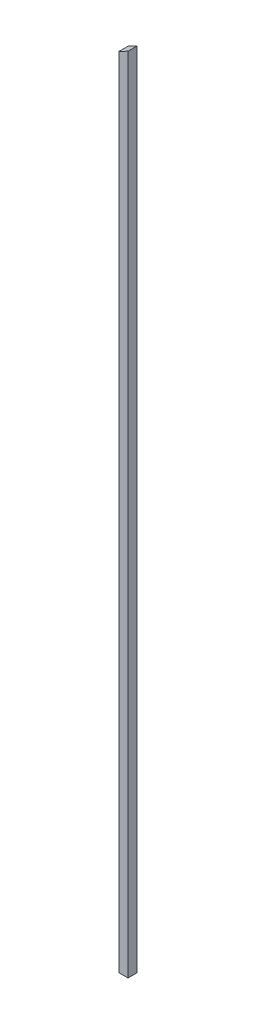
ISO-10303-21;
HEADER;
FILE_DESCRIPTION(('STEP AP214'),'2;1');
FILE_NAME('part.step','',(''),(''),'','','');
FILE_SCHEMA(('AUTOMOTIVE_DESIGN { 1 0 10303 214 1 1 1 1 }'));
ENDSEC;
DATA;
#1=APPLICATION_CONTEXT('core data for automotive mechanical design processes');
#2=APPLICATION_PROTOCOL_DEFINITION('international standard','automotive_design',2000,#1);
#3=PRODUCT_CONTEXT('',#1,'mechanical');
#4=PRODUCT('Part','Part','',(#3));
#5=PRODUCT_RELATED_PRODUCT_CATEGORY('part','',(#4));
#6=PRODUCT_DEFINITION_FORMATION('','',#4);
#7=PRODUCT_DEFINITION_CONTEXT('part definition',#1,'design');
#8=PRODUCT_DEFINITION('design','',#6,#7);
#9=PRODUCT_DEFINITION_SHAPE('','',#8);
#10=(LENGTH_UNIT() NAMED_UNIT(*) SI_UNIT(.MILLI.,.METRE.));
#11=(NAMED_UNIT(*) PLANE_ANGLE_UNIT() SI_UNIT($,.RADIAN.));
#12=(NAMED_UNIT(*) SI_UNIT($,.STERADIAN.) SOLID_ANGLE_UNIT());
#13=UNCERTAINTY_MEASURE_WITH_UNIT(LENGTH_MEASURE(1.E-05),#10,'distance_accuracy_value','');
#14=(GEOMETRIC_REPRESENTATION_CONTEXT(3) GLOBAL_UNCERTAINTY_ASSIGNED_CONTEXT((#13)) GLOBAL_UNIT_ASSIGNED_CONTEXT((#10,
#11,#12)) REPRESENTATION_CONTEXT('',''));
#15=CARTESIAN_POINT('',(0.,0.,0.));
#16=DIRECTION('',(0.,0.,1.));
#17=DIRECTION('',(1.,0.,0.));
#18=AXIS2_PLACEMENT_3D('',#15,#16,#17);
#19=CARTESIAN_POINT('',(4.7679880361686E-12,4572.,-12192.));
#20=DIRECTION('',(0.458883686879013,-0.888496348848055,0.));
#21=DIRECTION('',(0.888496348848055,0.458883686879013,0.));
#22=AXIS2_PLACEMENT_3D('',#19,#20,#21);
#23=PLANE('',#22);
#24=DIRECTION('',(0.888496348848055,0.458883686879013,0.));
#25=VECTOR('',#24,1.);
#26=CARTESIAN_POINT('',(12192.,10868.8293766007,-12192.));
#27=LINE('',#26,#25);
#28=CARTESIAN_POINT('',(-50.8000000000003,4545.76321093083,-12192.));
#29=VERTEX_POINT('',#28);
#30=CARTESIAN_POINT('',(4.7679880361686E-12,4572.,-12192.));
#31=VERTEX_POINT('',#30);
#32=EDGE_CURVE('E38',#29,#31,#27,.T.);
#33=ORIENTED_EDGE('',*,*,#32,.T.);
#34=DIRECTION('',(0.,0.,-1.));
#35=VECTOR('',#34,1.);
#36=CARTESIAN_POINT('',(0.,4572.,-12192.));
#37=LINE('',#36,#35);
#38=CARTESIAN_POINT('',(0.,4572.,-12242.8));
#39=VERTEX_POINT('',#38);
#40=EDGE_CURVE('E79',#31,#39,#37,.T.);
#41=ORIENTED_EDGE('',*,*,#40,.T.);
#42=DIRECTION('',(0.888496348848055,0.458883686879013,0.));
#43=VECTOR('',#42,1.);
#44=CARTESIAN_POINT('',(-1864.07974810505,3609.25458348143,-12242.8));
#45=LINE('',#44,#43);
#46=CARTESIAN_POINT('',(-50.8000000000001,4545.76321093083,-12242.8));
#47=VERTEX_POINT('',#46);
#48=EDGE_CURVE('E102',#47,#39,#45,.T.);
#49=ORIENTED_EDGE('',*,*,#48,.F.);
#50=DIRECTION('',(0.,0.,-1.));
#51=VECTOR('',#50,1.);
#52=CARTESIAN_POINT('',(-50.8,4545.76321093083,0.));
#53=LINE('',#52,#51);
#54=EDGE_CURVE('E59',#29,#47,#53,.T.);
#55=ORIENTED_EDGE('',*,*,#54,.F.);
#56=EDGE_LOOP('',(#33,#41,#49,#55));
#57=FACE_BOUND('',#56,.T.);
#58=ADVANCED_FACE('F34',(#57),#23,.F.);
#59=CARTESIAN_POINT('',(0.,50.8,0.));
#60=DIRECTION('',(0.,1.,0.));
#61=DIRECTION('',(0.,0.,1.));
#62=AXIS2_PLACEMENT_3D('',#59,#60,#61);
#63=PLANE('',#62);
#64=DIRECTION('',(-1.,0.,0.));
#65=VECTOR('',#64,1.);
#66=CARTESIAN_POINT('',(0.,50.8,-12242.8));
#67=LINE('',#66,#65);
#68=CARTESIAN_POINT('',(0.,50.8,-12242.8));
#69=VERTEX_POINT('',#68);
#70=CARTESIAN_POINT('',(-50.8,50.8,-12242.8));
#71=VERTEX_POINT('',#70);
#72=EDGE_CURVE('E99',#69,#71,#67,.T.);
#73=ORIENTED_EDGE('',*,*,#72,.F.);
#74=DIRECTION('',(0.,0.,1.));
#75=VECTOR('',#74,1.);
#76=CARTESIAN_POINT('',(0.,50.8,-12192.));
#77=LINE('',#76,#75);
#78=CARTESIAN_POINT('',(0.,50.8,-12192.));
#79=VERTEX_POINT('',#78);
#80=EDGE_CURVE('E87',#69,#79,#77,.T.);
#81=ORIENTED_EDGE('',*,*,#80,.T.);
#82=DIRECTION('',(1.,0.,0.));
#83=VECTOR('',#82,1.);
#84=CARTESIAN_POINT('',(0.,50.8,-12192.));
#85=LINE('',#84,#83);
#86=CARTESIAN_POINT('',(-50.8,50.8,-12192.));
#87=VERTEX_POINT('',#86);
#88=EDGE_CURVE('E11',#87,#79,#85,.T.);
#89=ORIENTED_EDGE('',*,*,#88,.F.);
#90=DIRECTION('',(0.,0.,1.));
#91=VECTOR('',#90,1.);
#92=CARTESIAN_POINT('',(-50.8,50.8,0.));
#93=LINE('',#92,#91);
#94=EDGE_CURVE('E51',#71,#87,#93,.T.);
#95=ORIENTED_EDGE('',*,*,#94,.F.);
#96=EDGE_LOOP('',(#73,#81,#89,#95));
#97=FACE_BOUND('',#96,.T.);
#98=ADVANCED_FACE('F98',(#97),#63,.F.);
#99=CARTESIAN_POINT('',(0.,50.8,-12192.));
#100=DIRECTION('',(1.,0.,0.));
#101=DIRECTION('',(0.,0.,-1.));
#102=AXIS2_PLACEMENT_3D('',#99,#100,#101);
#103=PLANE('',#102);
#104=ORIENTED_EDGE('',*,*,#80,.F.);
#105=DIRECTION('',(0.,1.,0.));
#106=VECTOR('',#105,1.);
#107=CARTESIAN_POINT('',(0.,0.,-12242.8));
#108=LINE('',#107,#106);
#109=EDGE_CURVE('E85',#69,#39,#108,.T.);
#110=ORIENTED_EDGE('',*,*,#109,.T.);
#111=ORIENTED_EDGE('',*,*,#40,.F.);
#112=DIRECTION('',(0.,-1.,0.));
#113=VECTOR('',#112,1.);
#114=CARTESIAN_POINT('',(0.,0.,-12192.));
#115=LINE('',#114,#113);
#116=EDGE_CURVE('E83',#31,#79,#115,.T.);
#117=ORIENTED_EDGE('',*,*,#116,.T.);
#118=EDGE_LOOP('',(#104,#110,#111,#117));
#119=FACE_BOUND('',#118,.T.);
#120=ADVANCED_FACE('F81',(#119),#103,.T.);
#121=CARTESIAN_POINT('',(12192.,10868.8293766007,-12192.));
#122=DIRECTION('',(0.,0.,1.));
#123=DIRECTION('',(1.,0.,0.));
#124=AXIS2_PLACEMENT_3D('',#121,#122,#123);
#125=PLANE('',#124);
#126=ORIENTED_EDGE('',*,*,#32,.F.);
#127=DIRECTION('',(0.,-1.,0.));
#128=VECTOR('',#127,1.);
#129=CARTESIAN_POINT('',(-50.8,0.,-12192.));
#130=LINE('',#129,#128);
#131=EDGE_CURVE('E95',#29,#87,#130,.T.);
#132=ORIENTED_EDGE('',*,*,#131,.T.);
#133=ORIENTED_EDGE('',*,*,#88,.T.);
#134=ORIENTED_EDGE('',*,*,#116,.F.);
#135=EDGE_LOOP('',(#126,#132,#133,#134));
#136=FACE_BOUND('',#135,.T.);
#137=ADVANCED_FACE('F92',(#136),#125,.T.);
#138=CARTESIAN_POINT('',(-50.8,0.,0.));
#139=DIRECTION('',(1.,0.,0.));
#140=DIRECTION('',(0.,0.,-1.));
#141=AXIS2_PLACEMENT_3D('',#138,#139,#140);
#142=PLANE('',#141);
#143=ORIENTED_EDGE('',*,*,#131,.F.);
#144=ORIENTED_EDGE('',*,*,#54,.T.);
#145=DIRECTION('',(0.,1.,0.));
#146=VECTOR('',#145,1.);
#147=CARTESIAN_POINT('',(-50.8,0.,-12242.8));
#148=LINE('',#147,#146);
#149=EDGE_CURVE('E43',#71,#47,#148,.T.);
#150=ORIENTED_EDGE('',*,*,#149,.F.);
#151=ORIENTED_EDGE('',*,*,#94,.T.);
#152=EDGE_LOOP('',(#143,#144,#150,#151));
#153=FACE_BOUND('',#152,.T.);
#154=ADVANCED_FACE('F36',(#153),#142,.F.);
#155=CARTESIAN_POINT('',(0.,0.,-12242.8));
#156=DIRECTION('',(0.,0.,1.));
#157=DIRECTION('',(1.,0.,0.));
#158=AXIS2_PLACEMENT_3D('',#155,#156,#157);
#159=PLANE('',#158);
#160=ORIENTED_EDGE('',*,*,#149,.T.);
#161=ORIENTED_EDGE('',*,*,#48,.T.);
#162=ORIENTED_EDGE('',*,*,#109,.F.);
#163=ORIENTED_EDGE('',*,*,#72,.T.);
#164=EDGE_LOOP('',(#160,#161,#162,#163));
#165=FACE_BOUND('',#164,.T.);
#166=ADVANCED_FACE('F104',(#165),#159,.F.);
#167=CLOSED_SHELL('',(#58,#98,#120,#137,#154,#166));
#168=MANIFOLD_SOLID_BREP('B2',#167);
#169=ADVANCED_BREP_SHAPE_REPRESENTATION('',(#18,#168),#14);
#170=SHAPE_DEFINITION_REPRESENTATION(#9,#169);
ENDSEC;
END-ISO-10303-21;
